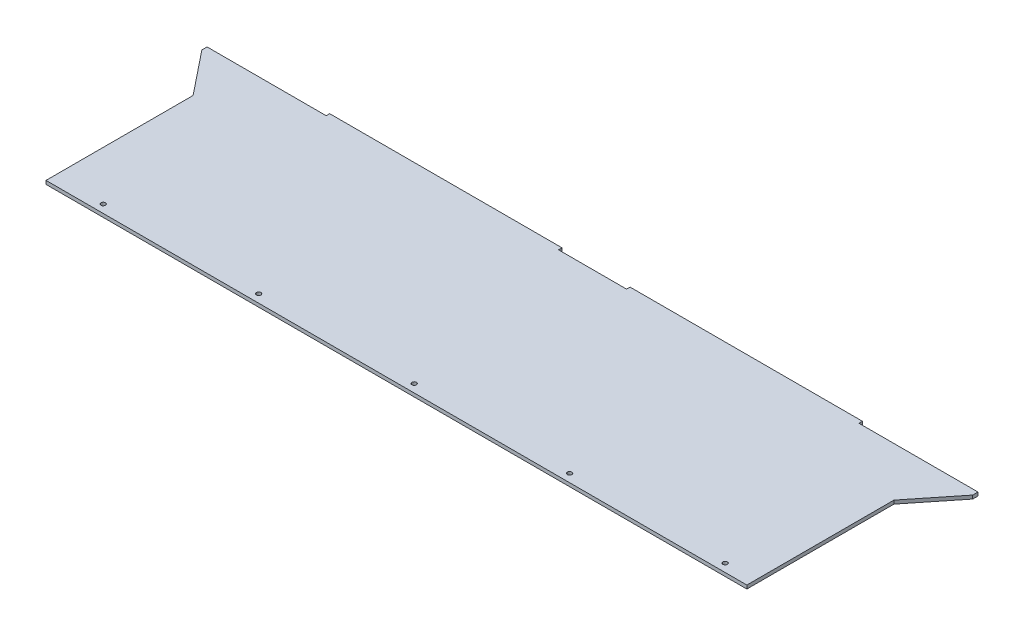
ISO-10303-21;
HEADER;
FILE_DESCRIPTION(('STEP AP214'),'2;1');
FILE_NAME('part.step','',(''),(''),'','','');
FILE_SCHEMA(('AUTOMOTIVE_DESIGN { 1 0 10303 214 1 1 1 1 }'));
ENDSEC;
DATA;
#1=APPLICATION_CONTEXT('core data for automotive mechanical design processes');
#2=APPLICATION_PROTOCOL_DEFINITION('international standard','automotive_design',2000,#1);
#3=PRODUCT_CONTEXT('',#1,'mechanical');
#4=PRODUCT('Part','Part','',(#3));
#5=PRODUCT_RELATED_PRODUCT_CATEGORY('part','',(#4));
#6=PRODUCT_DEFINITION_FORMATION('','',#4);
#7=PRODUCT_DEFINITION_CONTEXT('part definition',#1,'design');
#8=PRODUCT_DEFINITION('design','',#6,#7);
#9=PRODUCT_DEFINITION_SHAPE('','',#8);
#10=(LENGTH_UNIT() NAMED_UNIT(*) SI_UNIT(.MILLI.,.METRE.));
#11=(NAMED_UNIT(*) PLANE_ANGLE_UNIT() SI_UNIT($,.RADIAN.));
#12=(NAMED_UNIT(*) SI_UNIT($,.STERADIAN.) SOLID_ANGLE_UNIT());
#13=UNCERTAINTY_MEASURE_WITH_UNIT(LENGTH_MEASURE(1.E-05),#10,'distance_accuracy_value','');
#14=(GEOMETRIC_REPRESENTATION_CONTEXT(3) GLOBAL_UNCERTAINTY_ASSIGNED_CONTEXT((#13)) GLOBAL_UNIT_ASSIGNED_CONTEXT((#10,
#11,#12)) REPRESENTATION_CONTEXT('',''));
#15=CARTESIAN_POINT('',(0.,0.,0.));
#16=DIRECTION('',(0.,0.,1.));
#17=DIRECTION('',(1.,0.,0.));
#18=AXIS2_PLACEMENT_3D('',#15,#16,#17);
#19=CARTESIAN_POINT('',(290.6522,-8.4125,81.534));
#20=DIRECTION('',(0.,1.,0.));
#21=DIRECTION('',(0.,0.,1.));
#22=AXIS2_PLACEMENT_3D('',#19,#20,#21);
#23=CYLINDRICAL_SURFACE('',#22,2.02500000000001);
#24=CARTESIAN_POINT('',(290.6522,1.5875,81.534));
#25=DIRECTION('',(0.,1.,0.));
#26=DIRECTION('',(0.,0.,1.));
#27=AXIS2_PLACEMENT_3D('',#24,#25,#26);
#28=CIRCLE('',#27,2.02500000000001);
#29=CARTESIAN_POINT('',(290.6522,1.5875,83.559));
#30=VERTEX_POINT('',#29);
#31=EDGE_CURVE('E49',#30,#30,#28,.T.);
#32=ORIENTED_EDGE('',*,*,#31,.T.);
#33=EDGE_LOOP('',(#32));
#34=FACE_BOUND('',#33,.T.);
#35=CARTESIAN_POINT('',(290.6522,-1.5875,81.534));
#36=DIRECTION('',(0.,1.,0.));
#37=DIRECTION('',(0.,0.,1.));
#38=AXIS2_PLACEMENT_3D('',#35,#36,#37);
#39=CIRCLE('',#38,2.02500000000001);
#40=CARTESIAN_POINT('',(290.6522,-1.5875,83.559));
#41=VERTEX_POINT('',#40);
#42=EDGE_CURVE('E11',#41,#41,#39,.T.);
#43=ORIENTED_EDGE('',*,*,#42,.F.);
#44=EDGE_LOOP('',(#43));
#45=FACE_BOUND('',#44,.T.);
#46=ADVANCED_FACE('F41',(#34,#45),#23,.F.);
#47=CARTESIAN_POINT('',(149.6822,-8.4125,81.534));
#48=DIRECTION('',(0.,1.,0.));
#49=DIRECTION('',(0.,0.,1.));
#50=AXIS2_PLACEMENT_3D('',#47,#48,#49);
#51=CYLINDRICAL_SURFACE('',#50,2.02500000000001);
#52=CARTESIAN_POINT('',(149.6822,1.5875,81.534));
#53=DIRECTION('',(0.,1.,0.));
#54=DIRECTION('',(0.,0.,1.));
#55=AXIS2_PLACEMENT_3D('',#52,#53,#54);
#56=CIRCLE('',#55,2.02500000000001);
#57=CARTESIAN_POINT('',(149.6822,1.5875,83.559));
#58=VERTEX_POINT('',#57);
#59=EDGE_CURVE('E340',#58,#58,#56,.T.);
#60=ORIENTED_EDGE('',*,*,#59,.T.);
#61=EDGE_LOOP('',(#60));
#62=FACE_BOUND('',#61,.T.);
#63=CARTESIAN_POINT('',(149.6822,-1.5875,81.534));
#64=DIRECTION('',(0.,1.,0.));
#65=DIRECTION('',(0.,0.,1.));
#66=AXIS2_PLACEMENT_3D('',#63,#64,#65);
#67=CIRCLE('',#66,2.02500000000001);
#68=CARTESIAN_POINT('',(149.6822,-1.5875,83.559));
#69=VERTEX_POINT('',#68);
#70=EDGE_CURVE('E344',#69,#69,#67,.T.);
#71=ORIENTED_EDGE('',*,*,#70,.F.);
#72=EDGE_LOOP('',(#71));
#73=FACE_BOUND('',#72,.T.);
#74=ADVANCED_FACE('F371',(#62,#73),#51,.F.);
#75=CARTESIAN_POINT('',(8.71219999999989,-8.4125,81.534));
#76=DIRECTION('',(0.,1.,0.));
#77=DIRECTION('',(0.,0.,1.));
#78=AXIS2_PLACEMENT_3D('',#75,#76,#77);
#79=CYLINDRICAL_SURFACE('',#78,2.02500000000001);
#80=CARTESIAN_POINT('',(8.71219999999989,1.5875,81.534));
#81=DIRECTION('',(0.,1.,0.));
#82=DIRECTION('',(0.,0.,1.));
#83=AXIS2_PLACEMENT_3D('',#80,#81,#82);
#84=CIRCLE('',#83,2.02500000000001);
#85=CARTESIAN_POINT('',(8.71219999999989,1.5875,83.559));
#86=VERTEX_POINT('',#85);
#87=EDGE_CURVE('E329',#86,#86,#84,.T.);
#88=ORIENTED_EDGE('',*,*,#87,.T.);
#89=EDGE_LOOP('',(#88));
#90=FACE_BOUND('',#89,.T.);
#91=CARTESIAN_POINT('',(8.71219999999989,-1.5875,81.534));
#92=DIRECTION('',(0.,1.,0.));
#93=DIRECTION('',(0.,0.,1.));
#94=AXIS2_PLACEMENT_3D('',#91,#92,#93);
#95=CIRCLE('',#94,2.02500000000001);
#96=CARTESIAN_POINT('',(8.71219999999989,-1.5875,83.559));
#97=VERTEX_POINT('',#96);
#98=EDGE_CURVE('E336',#97,#97,#95,.T.);
#99=ORIENTED_EDGE('',*,*,#98,.F.);
#100=EDGE_LOOP('',(#99));
#101=FACE_BOUND('',#100,.T.);
#102=ADVANCED_FACE('F375',(#90,#101),#79,.F.);
#103=CARTESIAN_POINT('',(-317.6778,1.5875,-88.9));
#104=DIRECTION('',(1.,0.,0.));
#105=DIRECTION('',(0.,0.,-1.));
#106=AXIS2_PLACEMENT_3D('',#103,#104,#105);
#107=PLANE('',#106);
#108=DIRECTION('',(0.,1.,0.));
#109=VECTOR('',#108,1.);
#110=CARTESIAN_POINT('',(-317.6778,-1.5875,-44.4500000000001));
#111=LINE('',#110,#109);
#112=CARTESIAN_POINT('',(-317.6778,-1.5875,-44.4500000000001));
#113=VERTEX_POINT('',#112);
#114=CARTESIAN_POINT('',(-317.6778,1.5875,-44.4500000000001));
#115=VERTEX_POINT('',#114);
#116=EDGE_CURVE('E64',#113,#115,#111,.T.);
#117=ORIENTED_EDGE('',*,*,#116,.F.);
#118=DIRECTION('',(0.,0.,1.));
#119=VECTOR('',#118,1.);
#120=CARTESIAN_POINT('',(-317.6778,-1.5875,-88.9));
#121=LINE('',#120,#119);
#122=CARTESIAN_POINT('',(-317.6778,-1.5875,88.9));
#123=VERTEX_POINT('',#122);
#124=EDGE_CURVE('E169',#113,#123,#121,.T.);
#125=ORIENTED_EDGE('',*,*,#124,.T.);
#126=DIRECTION('',(0.,-1.,0.));
#127=VECTOR('',#126,1.);
#128=CARTESIAN_POINT('',(-317.6778,1.5875,88.9));
#129=LINE('',#128,#127);
#130=CARTESIAN_POINT('',(-317.6778,1.5875,88.9));
#131=VERTEX_POINT('',#130);
#132=EDGE_CURVE('E325',#131,#123,#129,.T.);
#133=ORIENTED_EDGE('',*,*,#132,.F.);
#134=DIRECTION('',(0.,0.,1.));
#135=VECTOR('',#134,1.);
#136=CARTESIAN_POINT('',(-317.6778,1.5875,-88.9));
#137=LINE('',#136,#135);
#138=EDGE_CURVE('E307',#115,#131,#137,.T.);
#139=ORIENTED_EDGE('',*,*,#138,.F.);
#140=EDGE_LOOP('',(#117,#125,#133,#139));
#141=FACE_BOUND('',#140,.T.);
#142=ADVANCED_FACE('F380',(#141),#107,.F.);
#143=CARTESIAN_POINT('',(-317.6778,1.5875,-88.9));
#144=DIRECTION('',(0.,0.,1.));
#145=DIRECTION('',(1.,0.,0.));
#146=AXIS2_PLACEMENT_3D('',#143,#144,#145);
#147=PLANE('',#146);
#148=DIRECTION('',(0.,1.,0.));
#149=VECTOR('',#148,1.);
#150=CARTESIAN_POINT('',(-241.4778,0.,-88.9));
#151=LINE('',#150,#149);
#152=CARTESIAN_POINT('',(-241.4778,-1.58749999999999,-88.9));
#153=VERTEX_POINT('',#152);
#154=CARTESIAN_POINT('',(-241.4778,1.5875,-88.9));
#155=VERTEX_POINT('',#154);
#156=EDGE_CURVE('E236',#153,#155,#151,.T.);
#157=ORIENTED_EDGE('',*,*,#156,.F.);
#158=DIRECTION('',(-1.,0.,0.));
#159=VECTOR('',#158,1.);
#160=CARTESIAN_POINT('',(-317.6778,-1.5875,-88.9));
#161=LINE('',#160,#159);
#162=CARTESIAN_POINT('',(-349.4278,-1.5875,-88.9));
#163=VERTEX_POINT('',#162);
#164=EDGE_CURVE('E172',#153,#163,#161,.T.);
#165=ORIENTED_EDGE('',*,*,#164,.T.);
#166=DIRECTION('',(0.,1.,0.));
#167=VECTOR('',#166,1.);
#168=CARTESIAN_POINT('',(-349.4278,-1.5875,-88.9));
#169=LINE('',#168,#167);
#170=CARTESIAN_POINT('',(-349.4278,1.5875,-88.9));
#171=VERTEX_POINT('',#170);
#172=EDGE_CURVE('E222',#163,#171,#169,.T.);
#173=ORIENTED_EDGE('',*,*,#172,.T.);
#174=DIRECTION('',(-1.,0.,0.));
#175=VECTOR('',#174,1.);
#176=CARTESIAN_POINT('',(-317.6778,1.5875,-88.9));
#177=LINE('',#176,#175);
#178=EDGE_CURVE('E303',#155,#171,#177,.T.);
#179=ORIENTED_EDGE('',*,*,#178,.F.);
#180=EDGE_LOOP('',(#157,#165,#173,#179));
#181=FACE_BOUND('',#180,.T.);
#182=ADVANCED_FACE('F392',(#181),#147,.F.);
#183=CARTESIAN_POINT('',(30.8229000000015,-1.58749999999999,-88.9));
#184=VERTEX_POINT('',#183);
#185=CARTESIAN_POINT('',(-30.8229000000015,-1.5875,-88.9));
#186=VERTEX_POINT('',#185);
#187=EDGE_CURVE('E170',#184,#186,#161,.T.);
#188=ORIENTED_EDGE('',*,*,#187,.T.);
#189=DIRECTION('',(0.,1.,0.));
#190=VECTOR('',#189,1.);
#191=CARTESIAN_POINT('',(-30.8229000000015,0.,-88.9));
#192=LINE('',#191,#190);
#193=CARTESIAN_POINT('',(-30.8229000000015,1.5875,-88.9));
#194=VERTEX_POINT('',#193);
#195=EDGE_CURVE('E226',#186,#194,#192,.T.);
#196=ORIENTED_EDGE('',*,*,#195,.T.);
#197=CARTESIAN_POINT('',(30.8229000000015,1.58749999999999,-88.9));
#198=VERTEX_POINT('',#197);
#199=EDGE_CURVE('E308',#198,#194,#177,.T.);
#200=ORIENTED_EDGE('',*,*,#199,.F.);
#201=DIRECTION('',(0.,-1.,0.));
#202=VECTOR('',#201,1.);
#203=CARTESIAN_POINT('',(30.8229000000015,0.,-88.9));
#204=LINE('',#203,#202);
#205=EDGE_CURVE('E266',#198,#184,#204,.T.);
#206=ORIENTED_EDGE('',*,*,#205,.T.);
#207=EDGE_LOOP('',(#188,#196,#200,#206));
#208=FACE_BOUND('',#207,.T.);
#209=ADVANCED_FACE('F388',(#208),#147,.F.);
#210=CARTESIAN_POINT('',(317.6778,1.5875,-88.9));
#211=DIRECTION('',(-1.,0.,0.));
#212=DIRECTION('',(0.,0.,1.));
#213=AXIS2_PLACEMENT_3D('',#210,#211,#212);
#214=PLANE('',#213);
#215=DIRECTION('',(0.,0.,-1.));
#216=VECTOR('',#215,1.);
#217=CARTESIAN_POINT('',(317.6778,-1.5875,-88.9));
#218=LINE('',#217,#216);
#219=CARTESIAN_POINT('',(317.6778,-1.5875,88.9));
#220=VERTEX_POINT('',#219);
#221=CARTESIAN_POINT('',(317.6778,-1.5875,-44.4500000000001));
#222=VERTEX_POINT('',#221);
#223=EDGE_CURVE('E298',#220,#222,#218,.T.);
#224=ORIENTED_EDGE('',*,*,#223,.T.);
#225=DIRECTION('',(0.,1.,0.));
#226=VECTOR('',#225,1.);
#227=CARTESIAN_POINT('',(317.6778,-1.5875,-44.4500000000001));
#228=LINE('',#227,#226);
#229=CARTESIAN_POINT('',(317.6778,1.5875,-44.4500000000001));
#230=VERTEX_POINT('',#229);
#231=EDGE_CURVE('E182',#222,#230,#228,.T.);
#232=ORIENTED_EDGE('',*,*,#231,.T.);
#233=DIRECTION('',(0.,0.,-1.));
#234=VECTOR('',#233,1.);
#235=CARTESIAN_POINT('',(317.6778,1.5875,-88.9));
#236=LINE('',#235,#234);
#237=CARTESIAN_POINT('',(317.6778,1.5875,88.9));
#238=VERTEX_POINT('',#237);
#239=EDGE_CURVE('E299',#238,#230,#236,.T.);
#240=ORIENTED_EDGE('',*,*,#239,.F.);
#241=DIRECTION('',(0.,-1.,0.));
#242=VECTOR('',#241,1.);
#243=CARTESIAN_POINT('',(317.6778,1.5875,88.9));
#244=LINE('',#243,#242);
#245=EDGE_CURVE('E314',#238,#220,#244,.T.);
#246=ORIENTED_EDGE('',*,*,#245,.T.);
#247=EDGE_LOOP('',(#224,#232,#240,#246));
#248=FACE_BOUND('',#247,.T.);
#249=ADVANCED_FACE('F385',(#248),#214,.F.);
#250=CARTESIAN_POINT('',(349.4278,-1.5875,-88.9));
#251=VERTEX_POINT('',#250);
#252=CARTESIAN_POINT('',(241.4778,-1.58749999999999,-88.9));
#253=VERTEX_POINT('',#252);
#254=EDGE_CURVE('E155',#251,#253,#161,.T.);
#255=ORIENTED_EDGE('',*,*,#254,.T.);
#256=DIRECTION('',(0.,1.,0.));
#257=VECTOR('',#256,1.);
#258=CARTESIAN_POINT('',(241.4778,2.11219930434936E-11,-88.9));
#259=LINE('',#258,#257);
#260=CARTESIAN_POINT('',(241.4778,1.5875,-88.9));
#261=VERTEX_POINT('',#260);
#262=EDGE_CURVE('E272',#253,#261,#259,.T.);
#263=ORIENTED_EDGE('',*,*,#262,.T.);
#264=CARTESIAN_POINT('',(349.4278,1.5875,-88.9));
#265=VERTEX_POINT('',#264);
#266=EDGE_CURVE('E177',#265,#261,#177,.T.);
#267=ORIENTED_EDGE('',*,*,#266,.F.);
#268=DIRECTION('',(0.,1.,0.));
#269=VECTOR('',#268,1.);
#270=CARTESIAN_POINT('',(349.4278,-1.5875,-88.9));
#271=LINE('',#270,#269);
#272=EDGE_CURVE('E174',#251,#265,#271,.T.);
#273=ORIENTED_EDGE('',*,*,#272,.F.);
#274=EDGE_LOOP('',(#255,#263,#267,#273));
#275=FACE_BOUND('',#274,.T.);
#276=ADVANCED_FACE('F175',(#275),#147,.F.);
#277=CARTESIAN_POINT('',(-317.6778,1.5875,88.9));
#278=DIRECTION('',(0.,0.,-1.));
#279=DIRECTION('',(-1.,0.,0.));
#280=AXIS2_PLACEMENT_3D('',#277,#278,#279);
#281=PLANE('',#280);
#282=DIRECTION('',(1.,0.,0.));
#283=VECTOR('',#282,1.);
#284=CARTESIAN_POINT('',(-317.6778,-1.5875,88.9));
#285=LINE('',#284,#283);
#286=EDGE_CURVE('E304',#123,#220,#285,.T.);
#287=ORIENTED_EDGE('',*,*,#286,.T.);
#288=ORIENTED_EDGE('',*,*,#245,.F.);
#289=DIRECTION('',(1.,0.,0.));
#290=VECTOR('',#289,1.);
#291=CARTESIAN_POINT('',(-317.6778,1.5875,88.9));
#292=LINE('',#291,#290);
#293=EDGE_CURVE('E311',#131,#238,#292,.T.);
#294=ORIENTED_EDGE('',*,*,#293,.F.);
#295=ORIENTED_EDGE('',*,*,#132,.T.);
#296=EDGE_LOOP('',(#287,#288,#294,#295));
#297=FACE_BOUND('',#296,.T.);
#298=ADVANCED_FACE('F355',(#297),#281,.F.);
#299=CARTESIAN_POINT('',(0.,1.5875,0.));
#300=DIRECTION('',(0.,1.,0.));
#301=DIRECTION('',(0.,0.,1.));
#302=AXIS2_PLACEMENT_3D('',#299,#300,#301);
#303=PLANE('',#302);
#304=CARTESIAN_POINT('',(-132.2578,1.5875,81.534));
#305=DIRECTION('',(0.,1.,0.));
#306=DIRECTION('',(0.,0.,1.));
#307=AXIS2_PLACEMENT_3D('',#304,#305,#306);
#308=CIRCLE('',#307,2.02500000000001);
#309=CARTESIAN_POINT('',(-132.2578,1.5875,83.559));
#310=VERTEX_POINT('',#309);
#311=EDGE_CURVE('E568',#310,#310,#308,.T.);
#312=ORIENTED_EDGE('',*,*,#311,.F.);
#313=EDGE_LOOP('',(#312));
#314=FACE_BOUND('',#313,.T.);
#315=CARTESIAN_POINT('',(-273.2278,1.5875,81.534));
#316=DIRECTION('',(0.,1.,0.));
#317=DIRECTION('',(0.,0.,1.));
#318=AXIS2_PLACEMENT_3D('',#315,#316,#317);
#319=CIRCLE('',#318,2.02500000000001);
#320=CARTESIAN_POINT('',(-273.2278,1.5875,83.559));
#321=VERTEX_POINT('',#320);
#322=EDGE_CURVE('E195',#321,#321,#319,.T.);
#323=ORIENTED_EDGE('',*,*,#322,.F.);
#324=EDGE_LOOP('',(#323));
#325=FACE_BOUND('',#324,.T.);
#326=ORIENTED_EDGE('',*,*,#239,.T.);
#327=DIRECTION('',(-0.624695047554424,0.,0.78086880944303));
#328=VECTOR('',#327,1.);
#329=CARTESIAN_POINT('',(172.023048780488,1.5875,137.61843902439));
#330=LINE('',#329,#328);
#331=CARTESIAN_POINT('',(349.4278,1.5875,-84.1375));
#332=VERTEX_POINT('',#331);
#333=EDGE_CURVE('E56',#332,#230,#330,.T.);
#334=ORIENTED_EDGE('',*,*,#333,.F.);
#335=DIRECTION('',(0.,0.,1.));
#336=VECTOR('',#335,1.);
#337=CARTESIAN_POINT('',(349.4278,1.5875,0.));
#338=LINE('',#337,#336);
#339=EDGE_CURVE('E192',#265,#332,#338,.T.);
#340=ORIENTED_EDGE('',*,*,#339,.F.);
#341=ORIENTED_EDGE('',*,*,#266,.T.);
#342=DIRECTION('',(0.,0.,1.));
#343=VECTOR('',#342,1.);
#344=CARTESIAN_POINT('',(241.4778,1.58749999999999,-92.075));
#345=LINE('',#344,#343);
#346=CARTESIAN_POINT('',(241.4778,1.58749999999999,-92.075));
#347=VERTEX_POINT('',#346);
#348=EDGE_CURVE('E292',#347,#261,#345,.T.);
#349=ORIENTED_EDGE('',*,*,#348,.F.);
#350=DIRECTION('',(1.,0.,0.));
#351=VECTOR('',#350,1.);
#352=CARTESIAN_POINT('',(0.,1.58749999999999,-92.075));
#353=LINE('',#352,#351);
#354=CARTESIAN_POINT('',(30.8229000000015,1.58749999999999,-92.075));
#355=VERTEX_POINT('',#354);
#356=EDGE_CURVE('E271',#355,#347,#353,.T.);
#357=ORIENTED_EDGE('',*,*,#356,.F.);
#358=DIRECTION('',(0.,0.,1.));
#359=VECTOR('',#358,1.);
#360=CARTESIAN_POINT('',(30.8229000000015,1.58749999999999,-92.075));
#361=LINE('',#360,#359);
#362=EDGE_CURVE('E295',#355,#198,#361,.T.);
#363=ORIENTED_EDGE('',*,*,#362,.T.);
#364=ORIENTED_EDGE('',*,*,#199,.T.);
#365=DIRECTION('',(0.,0.,1.));
#366=VECTOR('',#365,1.);
#367=CARTESIAN_POINT('',(-30.8229000000015,1.58749999999999,-92.075));
#368=LINE('',#367,#366);
#369=CARTESIAN_POINT('',(-30.8229000000015,1.58749999999999,-92.075));
#370=VERTEX_POINT('',#369);
#371=EDGE_CURVE('E245',#370,#194,#368,.T.);
#372=ORIENTED_EDGE('',*,*,#371,.F.);
#373=DIRECTION('',(1.,0.,0.));
#374=VECTOR('',#373,1.);
#375=CARTESIAN_POINT('',(0.,1.58749999999999,-92.075));
#376=LINE('',#375,#374);
#377=CARTESIAN_POINT('',(-241.4778,1.58749999999999,-92.075));
#378=VERTEX_POINT('',#377);
#379=EDGE_CURVE('E242',#378,#370,#376,.T.);
#380=ORIENTED_EDGE('',*,*,#379,.F.);
#381=DIRECTION('',(0.,0.,1.));
#382=VECTOR('',#381,1.);
#383=CARTESIAN_POINT('',(-241.4778,1.58749999999999,-92.075));
#384=LINE('',#383,#382);
#385=EDGE_CURVE('E254',#378,#155,#384,.T.);
#386=ORIENTED_EDGE('',*,*,#385,.T.);
#387=ORIENTED_EDGE('',*,*,#178,.T.);
#388=DIRECTION('',(0.,0.,1.));
#389=VECTOR('',#388,1.);
#390=CARTESIAN_POINT('',(-349.4278,1.5875,0.));
#391=LINE('',#390,#389);
#392=CARTESIAN_POINT('',(-349.4278,1.5875,-84.1375));
#393=VERTEX_POINT('',#392);
#394=EDGE_CURVE('E203',#171,#393,#391,.T.);
#395=ORIENTED_EDGE('',*,*,#394,.T.);
#396=DIRECTION('',(0.624695047554424,0.,0.78086880944303));
#397=VECTOR('',#396,1.);
#398=CARTESIAN_POINT('',(-172.023048780488,1.5875,137.61843902439));
#399=LINE('',#398,#397);
#400=EDGE_CURVE('E211',#393,#115,#399,.T.);
#401=ORIENTED_EDGE('',*,*,#400,.T.);
#402=ORIENTED_EDGE('',*,*,#138,.T.);
#403=ORIENTED_EDGE('',*,*,#293,.T.);
#404=EDGE_LOOP('',(#326,#334,#340,#341,#349,#357,#363,#364,#372,#380,#386,#387,#395,#401,#402,#403));
#405=FACE_BOUND('',#404,.T.);
#406=ORIENTED_EDGE('',*,*,#87,.F.);
#407=EDGE_LOOP('',(#406));
#408=FACE_BOUND('',#407,.T.);
#409=ORIENTED_EDGE('',*,*,#59,.F.);
#410=EDGE_LOOP('',(#409));
#411=FACE_BOUND('',#410,.T.);
#412=ORIENTED_EDGE('',*,*,#31,.F.);
#413=EDGE_LOOP('',(#412));
#414=FACE_BOUND('',#413,.T.);
#415=ADVANCED_FACE('F353',(#314,#325,#405,#408,#411,#414),#303,.T.);
#416=CARTESIAN_POINT('',(0.,-1.5875,0.));
#417=DIRECTION('',(0.,1.,0.));
#418=DIRECTION('',(0.,0.,1.));
#419=AXIS2_PLACEMENT_3D('',#416,#417,#418);
#420=PLANE('',#419);
#421=CARTESIAN_POINT('',(-132.2578,-1.5875,81.534));
#422=DIRECTION('',(0.,1.,0.));
#423=DIRECTION('',(0.,0.,1.));
#424=AXIS2_PLACEMENT_3D('',#421,#422,#423);
#425=CIRCLE('',#424,2.02500000000001);
#426=CARTESIAN_POINT('',(-132.2578,-1.5875,83.559));
#427=VERTEX_POINT('',#426);
#428=EDGE_CURVE('E571',#427,#427,#425,.T.);
#429=ORIENTED_EDGE('',*,*,#428,.T.);
#430=EDGE_LOOP('',(#429));
#431=FACE_BOUND('',#430,.T.);
#432=CARTESIAN_POINT('',(-273.2278,-1.5875,81.534));
#433=DIRECTION('',(0.,1.,0.));
#434=DIRECTION('',(0.,0.,1.));
#435=AXIS2_PLACEMENT_3D('',#432,#433,#434);
#436=CIRCLE('',#435,2.02500000000001);
#437=CARTESIAN_POINT('',(-273.2278,-1.5875,83.559));
#438=VERTEX_POINT('',#437);
#439=EDGE_CURVE('E199',#438,#438,#436,.T.);
#440=ORIENTED_EDGE('',*,*,#439,.T.);
#441=EDGE_LOOP('',(#440));
#442=FACE_BOUND('',#441,.T.);
#443=ORIENTED_EDGE('',*,*,#223,.F.);
#444=ORIENTED_EDGE('',*,*,#286,.F.);
#445=ORIENTED_EDGE('',*,*,#124,.F.);
#446=DIRECTION('',(0.624695047554424,0.,0.78086880944303));
#447=VECTOR('',#446,1.);
#448=CARTESIAN_POINT('',(-172.023048780488,-1.5875,137.61843902439));
#449=LINE('',#448,#447);
#450=CARTESIAN_POINT('',(-349.4278,-1.5875,-84.1375));
#451=VERTEX_POINT('',#450);
#452=EDGE_CURVE('E210',#451,#113,#449,.T.);
#453=ORIENTED_EDGE('',*,*,#452,.F.);
#454=DIRECTION('',(0.,0.,1.));
#455=VECTOR('',#454,1.);
#456=CARTESIAN_POINT('',(-349.4278,-1.5875,0.));
#457=LINE('',#456,#455);
#458=EDGE_CURVE('E206',#163,#451,#457,.T.);
#459=ORIENTED_EDGE('',*,*,#458,.F.);
#460=ORIENTED_EDGE('',*,*,#164,.F.);
#461=DIRECTION('',(0.,0.,1.));
#462=VECTOR('',#461,1.);
#463=CARTESIAN_POINT('',(-241.4778,-1.58749999999999,-92.075));
#464=LINE('',#463,#462);
#465=CARTESIAN_POINT('',(-241.4778,-1.58749999999999,-92.075));
#466=VERTEX_POINT('',#465);
#467=EDGE_CURVE('E258',#466,#153,#464,.T.);
#468=ORIENTED_EDGE('',*,*,#467,.F.);
#469=DIRECTION('',(-1.,0.,0.));
#470=VECTOR('',#469,1.);
#471=CARTESIAN_POINT('',(0.,-1.58749999999999,-92.075));
#472=LINE('',#471,#470);
#473=CARTESIAN_POINT('',(-30.8229000000015,-1.58749999999999,-92.075));
#474=VERTEX_POINT('',#473);
#475=EDGE_CURVE('E235',#474,#466,#472,.T.);
#476=ORIENTED_EDGE('',*,*,#475,.F.);
#477=DIRECTION('',(0.,0.,1.));
#478=VECTOR('',#477,1.);
#479=CARTESIAN_POINT('',(-30.8229000000015,-1.58749999999999,-92.075));
#480=LINE('',#479,#478);
#481=EDGE_CURVE('E262',#474,#186,#480,.T.);
#482=ORIENTED_EDGE('',*,*,#481,.T.);
#483=ORIENTED_EDGE('',*,*,#187,.F.);
#484=DIRECTION('',(0.,0.,1.));
#485=VECTOR('',#484,1.);
#486=CARTESIAN_POINT('',(30.8229000000015,-1.58749999999999,-92.075));
#487=LINE('',#486,#485);
#488=CARTESIAN_POINT('',(30.8229000000015,-1.58749999999999,-92.075));
#489=VERTEX_POINT('',#488);
#490=EDGE_CURVE('E282',#489,#184,#487,.T.);
#491=ORIENTED_EDGE('',*,*,#490,.F.);
#492=DIRECTION('',(-1.,0.,0.));
#493=VECTOR('',#492,1.);
#494=CARTESIAN_POINT('',(0.,-1.58749999999999,-92.075));
#495=LINE('',#494,#493);
#496=CARTESIAN_POINT('',(241.4778,-1.58749999999999,-92.075));
#497=VERTEX_POINT('',#496);
#498=EDGE_CURVE('E279',#497,#489,#495,.T.);
#499=ORIENTED_EDGE('',*,*,#498,.F.);
#500=DIRECTION('',(0.,0.,1.));
#501=VECTOR('',#500,1.);
#502=CARTESIAN_POINT('',(241.4778,-1.58749999999999,-92.075));
#503=LINE('',#502,#501);
#504=EDGE_CURVE('E164',#497,#253,#503,.T.);
#505=ORIENTED_EDGE('',*,*,#504,.T.);
#506=ORIENTED_EDGE('',*,*,#254,.F.);
#507=DIRECTION('',(0.,0.,1.));
#508=VECTOR('',#507,1.);
#509=CARTESIAN_POINT('',(349.4278,-1.5875,0.));
#510=LINE('',#509,#508);
#511=CARTESIAN_POINT('',(349.4278,-1.5875,-84.1375));
#512=VERTEX_POINT('',#511);
#513=EDGE_CURVE('E161',#251,#512,#510,.T.);
#514=ORIENTED_EDGE('',*,*,#513,.T.);
#515=DIRECTION('',(-0.624695047554424,0.,0.78086880944303));
#516=VECTOR('',#515,1.);
#517=CARTESIAN_POINT('',(172.023048780488,-1.5875,137.61843902439));
#518=LINE('',#517,#516);
#519=EDGE_CURVE('E183',#512,#222,#518,.T.);
#520=ORIENTED_EDGE('',*,*,#519,.T.);
#521=EDGE_LOOP('',(#443,#444,#445,#453,#459,#460,#468,#476,#482,#483,#491,#499,#505,#506,#514,#520));
#522=FACE_BOUND('',#521,.T.);
#523=ORIENTED_EDGE('',*,*,#98,.T.);
#524=EDGE_LOOP('',(#523));
#525=FACE_BOUND('',#524,.T.);
#526=ORIENTED_EDGE('',*,*,#70,.T.);
#527=EDGE_LOOP('',(#526));
#528=FACE_BOUND('',#527,.T.);
#529=ORIENTED_EDGE('',*,*,#42,.T.);
#530=EDGE_LOOP('',(#529));
#531=FACE_BOUND('',#530,.T.);
#532=ADVANCED_FACE('F158',(#431,#442,#522,#525,#528,#531),#420,.F.);
#533=CARTESIAN_POINT('',(30.8229000000015,0.,-92.075));
#534=DIRECTION('',(-1.,0.,0.));
#535=DIRECTION('',(0.,-1.,0.));
#536=AXIS2_PLACEMENT_3D('',#533,#534,#535);
#537=PLANE('',#536);
#538=ORIENTED_EDGE('',*,*,#205,.F.);
#539=ORIENTED_EDGE('',*,*,#362,.F.);
#540=DIRECTION('',(0.,-1.,0.));
#541=VECTOR('',#540,1.);
#542=CARTESIAN_POINT('',(30.8229000000015,0.,-92.075));
#543=LINE('',#542,#541);
#544=EDGE_CURVE('E267',#355,#489,#543,.T.);
#545=ORIENTED_EDGE('',*,*,#544,.T.);
#546=ORIENTED_EDGE('',*,*,#490,.T.);
#547=EDGE_LOOP('',(#538,#539,#545,#546));
#548=FACE_BOUND('',#547,.T.);
#549=ADVANCED_FACE('F362',(#548),#537,.T.);
#550=CARTESIAN_POINT('',(241.4778,2.11219930434936E-11,-92.075));
#551=DIRECTION('',(1.,0.,0.));
#552=DIRECTION('',(0.,1.,0.));
#553=AXIS2_PLACEMENT_3D('',#550,#551,#552);
#554=PLANE('',#553);
#555=ORIENTED_EDGE('',*,*,#262,.F.);
#556=ORIENTED_EDGE('',*,*,#504,.F.);
#557=DIRECTION('',(0.,1.,0.));
#558=VECTOR('',#557,1.);
#559=CARTESIAN_POINT('',(241.4778,2.11219930434936E-11,-92.075));
#560=LINE('',#559,#558);
#561=EDGE_CURVE('E275',#497,#347,#560,.T.);
#562=ORIENTED_EDGE('',*,*,#561,.T.);
#563=ORIENTED_EDGE('',*,*,#348,.T.);
#564=EDGE_LOOP('',(#555,#556,#562,#563));
#565=FACE_BOUND('',#564,.T.);
#566=ADVANCED_FACE('F470',(#565),#554,.T.);
#567=CARTESIAN_POINT('',(0.,0.,-92.075));
#568=DIRECTION('',(0.,0.,-1.));
#569=DIRECTION('',(-1.,0.,0.));
#570=AXIS2_PLACEMENT_3D('',#567,#568,#569);
#571=PLANE('',#570);
#572=ORIENTED_EDGE('',*,*,#544,.F.);
#573=ORIENTED_EDGE('',*,*,#356,.T.);
#574=ORIENTED_EDGE('',*,*,#561,.F.);
#575=ORIENTED_EDGE('',*,*,#498,.T.);
#576=EDGE_LOOP('',(#572,#573,#574,#575));
#577=FACE_BOUND('',#576,.T.);
#578=ADVANCED_FACE('F467',(#577),#571,.T.);
#579=CARTESIAN_POINT('',(-30.8229000000015,0.,-92.075));
#580=DIRECTION('',(1.,0.,0.));
#581=DIRECTION('',(0.,0.,-1.));
#582=AXIS2_PLACEMENT_3D('',#579,#580,#581);
#583=PLANE('',#582);
#584=ORIENTED_EDGE('',*,*,#195,.F.);
#585=ORIENTED_EDGE('',*,*,#481,.F.);
#586=DIRECTION('',(0.,1.,0.));
#587=VECTOR('',#586,1.);
#588=CARTESIAN_POINT('',(-30.8229000000015,0.,-92.075));
#589=LINE('',#588,#587);
#590=EDGE_CURVE('E231',#474,#370,#589,.T.);
#591=ORIENTED_EDGE('',*,*,#590,.T.);
#592=ORIENTED_EDGE('',*,*,#371,.T.);
#593=EDGE_LOOP('',(#584,#585,#591,#592));
#594=FACE_BOUND('',#593,.T.);
#595=ADVANCED_FACE('F422',(#594),#583,.T.);
#596=CARTESIAN_POINT('',(-241.4778,0.,-92.075));
#597=DIRECTION('',(1.,0.,0.));
#598=DIRECTION('',(0.,0.,-1.));
#599=AXIS2_PLACEMENT_3D('',#596,#597,#598);
#600=PLANE('',#599);
#601=ORIENTED_EDGE('',*,*,#156,.T.);
#602=ORIENTED_EDGE('',*,*,#385,.F.);
#603=DIRECTION('',(0.,1.,0.));
#604=VECTOR('',#603,1.);
#605=CARTESIAN_POINT('',(-241.4778,0.,-92.075));
#606=LINE('',#605,#604);
#607=EDGE_CURVE('E239',#466,#378,#606,.T.);
#608=ORIENTED_EDGE('',*,*,#607,.F.);
#609=ORIENTED_EDGE('',*,*,#467,.T.);
#610=EDGE_LOOP('',(#601,#602,#608,#609));
#611=FACE_BOUND('',#610,.T.);
#612=ADVANCED_FACE('F408',(#611),#600,.F.);
#613=CARTESIAN_POINT('',(0.,0.,-92.075));
#614=DIRECTION('',(0.,0.,-1.));
#615=DIRECTION('',(-1.,0.,0.));
#616=AXIS2_PLACEMENT_3D('',#613,#614,#615);
#617=PLANE('',#616);
#618=ORIENTED_EDGE('',*,*,#590,.F.);
#619=ORIENTED_EDGE('',*,*,#475,.T.);
#620=ORIENTED_EDGE('',*,*,#607,.T.);
#621=ORIENTED_EDGE('',*,*,#379,.T.);
#622=EDGE_LOOP('',(#618,#619,#620,#621));
#623=FACE_BOUND('',#622,.T.);
#624=ADVANCED_FACE('F459',(#623),#617,.T.);
#625=CARTESIAN_POINT('',(-349.4278,-1.5875,0.));
#626=DIRECTION('',(-1.,0.,0.));
#627=DIRECTION('',(0.,0.,1.));
#628=AXIS2_PLACEMENT_3D('',#625,#626,#627);
#629=PLANE('',#628);
#630=ORIENTED_EDGE('',*,*,#394,.F.);
#631=ORIENTED_EDGE('',*,*,#172,.F.);
#632=ORIENTED_EDGE('',*,*,#458,.T.);
#633=DIRECTION('',(0.,1.,0.));
#634=VECTOR('',#633,1.);
#635=CARTESIAN_POINT('',(-349.4278,-1.5875,-84.1375));
#636=LINE('',#635,#634);
#637=EDGE_CURVE('E215',#451,#393,#636,.T.);
#638=ORIENTED_EDGE('',*,*,#637,.T.);
#639=EDGE_LOOP('',(#630,#631,#632,#638));
#640=FACE_BOUND('',#639,.T.);
#641=ADVANCED_FACE('F432',(#640),#629,.T.);
#642=CARTESIAN_POINT('',(-172.023048780488,-1.5875,137.61843902439));
#643=DIRECTION('',(-0.78086880944303,0.,0.624695047554424));
#644=DIRECTION('',(0.624695047554424,0.,0.78086880944303));
#645=AXIS2_PLACEMENT_3D('',#642,#643,#644);
#646=PLANE('',#645);
#647=ORIENTED_EDGE('',*,*,#400,.F.);
#648=ORIENTED_EDGE('',*,*,#637,.F.);
#649=ORIENTED_EDGE('',*,*,#452,.T.);
#650=ORIENTED_EDGE('',*,*,#116,.T.);
#651=EDGE_LOOP('',(#647,#648,#649,#650));
#652=FACE_BOUND('',#651,.T.);
#653=ADVANCED_FACE('F435',(#652),#646,.T.);
#654=CARTESIAN_POINT('',(349.4278,-1.5875,0.));
#655=DIRECTION('',(-1.,0.,0.));
#656=DIRECTION('',(0.,0.,1.));
#657=AXIS2_PLACEMENT_3D('',#654,#655,#656);
#658=PLANE('',#657);
#659=ORIENTED_EDGE('',*,*,#339,.T.);
#660=DIRECTION('',(0.,1.,0.));
#661=VECTOR('',#660,1.);
#662=CARTESIAN_POINT('',(349.4278,-1.5875,-84.1375));
#663=LINE('',#662,#661);
#664=EDGE_CURVE('E186',#512,#332,#663,.T.);
#665=ORIENTED_EDGE('',*,*,#664,.F.);
#666=ORIENTED_EDGE('',*,*,#513,.F.);
#667=ORIENTED_EDGE('',*,*,#272,.T.);
#668=EDGE_LOOP('',(#659,#665,#666,#667));
#669=FACE_BOUND('',#668,.T.);
#670=ADVANCED_FACE('F185',(#669),#658,.F.);
#671=CARTESIAN_POINT('',(172.023048780488,-1.5875,137.61843902439));
#672=DIRECTION('',(-0.78086880944303,0.,-0.624695047554424));
#673=DIRECTION('',(-0.624695047554424,0.,0.78086880944303));
#674=AXIS2_PLACEMENT_3D('',#671,#672,#673);
#675=PLANE('',#674);
#676=ORIENTED_EDGE('',*,*,#333,.T.);
#677=ORIENTED_EDGE('',*,*,#231,.F.);
#678=ORIENTED_EDGE('',*,*,#519,.F.);
#679=ORIENTED_EDGE('',*,*,#664,.T.);
#680=EDGE_LOOP('',(#676,#677,#678,#679));
#681=FACE_BOUND('',#680,.T.);
#682=ADVANCED_FACE('F441',(#681),#675,.F.);
#683=CARTESIAN_POINT('',(-273.2278,-8.4125,81.534));
#684=DIRECTION('',(0.,1.,0.));
#685=DIRECTION('',(0.,0.,1.));
#686=AXIS2_PLACEMENT_3D('',#683,#684,#685);
#687=CYLINDRICAL_SURFACE('',#686,2.02500000000001);
#688=ORIENTED_EDGE('',*,*,#322,.T.);
#689=EDGE_LOOP('',(#688));
#690=FACE_BOUND('',#689,.T.);
#691=ORIENTED_EDGE('',*,*,#439,.F.);
#692=EDGE_LOOP('',(#691));
#693=FACE_BOUND('',#692,.T.);
#694=ADVANCED_FACE('F443',(#690,#693),#687,.F.);
#695=CARTESIAN_POINT('',(-132.2578,-8.4125,81.534));
#696=DIRECTION('',(0.,1.,0.));
#697=DIRECTION('',(0.,0.,1.));
#698=AXIS2_PLACEMENT_3D('',#695,#696,#697);
#699=CYLINDRICAL_SURFACE('',#698,2.02500000000001);
#700=ORIENTED_EDGE('',*,*,#311,.T.);
#701=EDGE_LOOP('',(#700));
#702=FACE_BOUND('',#701,.T.);
#703=ORIENTED_EDGE('',*,*,#428,.F.);
#704=EDGE_LOOP('',(#703));
#705=FACE_BOUND('',#704,.T.);
#706=ADVANCED_FACE('F449',(#702,#705),#699,.F.);
#707=CLOSED_SHELL('',(#46,#74,#102,#142,#182,#209,#249,#276,#298,#415,#532,#549,#566,#578,#595,
#612,#624,#641,#653,#670,#682,#694,#706));
#708=MANIFOLD_SOLID_BREP('B2',#707);
#709=ADVANCED_BREP_SHAPE_REPRESENTATION('',(#18,#708),#14);
#710=SHAPE_DEFINITION_REPRESENTATION(#9,#709);
ENDSEC;
END-ISO-10303-21;
